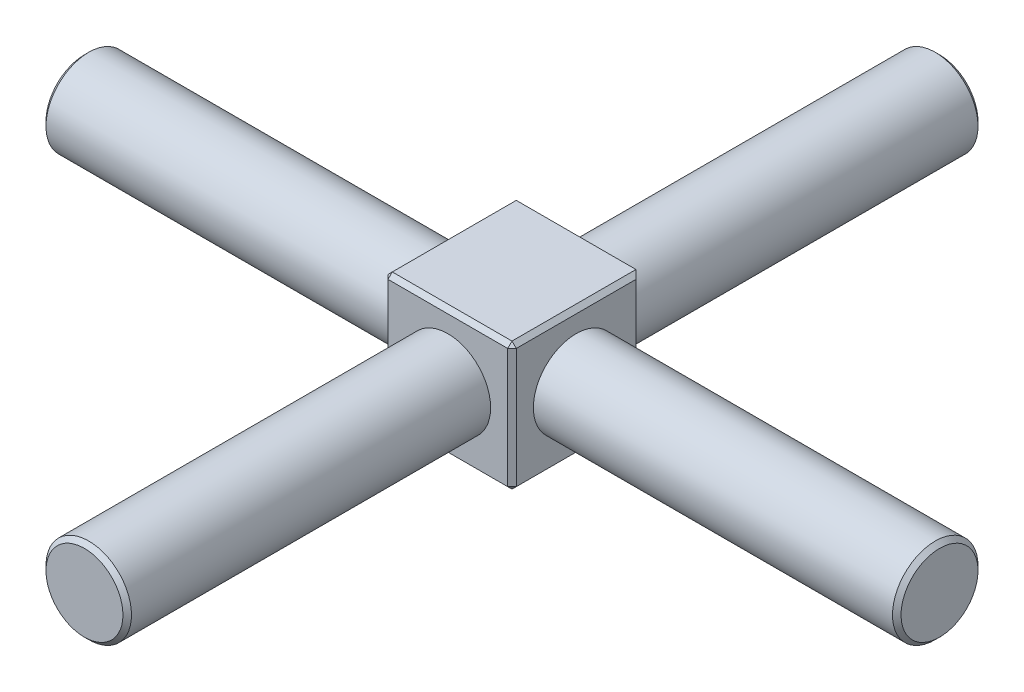
ISO-10303-21;
HEADER;
FILE_DESCRIPTION(('STEP AP214'),'2;1');
FILE_NAME('part.step','',(''),(''),'','','');
FILE_SCHEMA(('AUTOMOTIVE_DESIGN { 1 0 10303 214 1 1 1 1 }'));
ENDSEC;
DATA;
#1=APPLICATION_CONTEXT('core data for automotive mechanical design processes');
#2=APPLICATION_PROTOCOL_DEFINITION('international standard','automotive_design',2000,#1);
#3=PRODUCT_CONTEXT('',#1,'mechanical');
#4=PRODUCT('Part','Part','',(#3));
#5=PRODUCT_RELATED_PRODUCT_CATEGORY('part','',(#4));
#6=PRODUCT_DEFINITION_FORMATION('','',#4);
#7=PRODUCT_DEFINITION_CONTEXT('part definition',#1,'design');
#8=PRODUCT_DEFINITION('design','',#6,#7);
#9=PRODUCT_DEFINITION_SHAPE('','',#8);
#10=(LENGTH_UNIT() NAMED_UNIT(*) SI_UNIT(.MILLI.,.METRE.));
#11=(NAMED_UNIT(*) PLANE_ANGLE_UNIT() SI_UNIT($,.RADIAN.));
#12=(NAMED_UNIT(*) SI_UNIT($,.STERADIAN.) SOLID_ANGLE_UNIT());
#13=UNCERTAINTY_MEASURE_WITH_UNIT(LENGTH_MEASURE(1.E-05),#10,'distance_accuracy_value','');
#14=(GEOMETRIC_REPRESENTATION_CONTEXT(3) GLOBAL_UNCERTAINTY_ASSIGNED_CONTEXT((#13)) GLOBAL_UNIT_ASSIGNED_CONTEXT((#10,
#11,#12)) REPRESENTATION_CONTEXT('',''));
#15=CARTESIAN_POINT('',(0.,0.,0.));
#16=DIRECTION('',(0.,0.,1.));
#17=DIRECTION('',(1.,0.,0.));
#18=AXIS2_PLACEMENT_3D('',#15,#16,#17);
#19=CARTESIAN_POINT('',(7.5,7.5,15.));
#20=DIRECTION('',(-1.,0.,0.));
#21=DIRECTION('',(0.,-1.,0.));
#22=AXIS2_PLACEMENT_3D('',#19,#20,#21);
#23=PLANE('',#22);
#24=DIRECTION('',(0.,1.,0.));
#25=VECTOR('',#24,1.);
#26=CARTESIAN_POINT('',(7.5,7.5,0.5));
#27=LINE('',#26,#25);
#28=CARTESIAN_POINT('',(7.5,-7.,0.5));
#29=VERTEX_POINT('',#28);
#30=CARTESIAN_POINT('',(7.5,7.,0.5));
#31=VERTEX_POINT('',#30);
#32=EDGE_CURVE('E45',#29,#31,#27,.T.);
#33=ORIENTED_EDGE('',*,*,#32,.T.);
#34=DIRECTION('',(0.,0.,1.));
#35=VECTOR('',#34,1.);
#36=CARTESIAN_POINT('',(7.5,7.,15.));
#37=LINE('',#36,#35);
#38=CARTESIAN_POINT('',(7.5,7.,14.5));
#39=VERTEX_POINT('',#38);
#40=EDGE_CURVE('E11',#31,#39,#37,.T.);
#41=ORIENTED_EDGE('',*,*,#40,.T.);
#42=DIRECTION('',(0.,-1.,0.));
#43=VECTOR('',#42,1.);
#44=CARTESIAN_POINT('',(7.5,-7.5,14.5));
#45=LINE('',#44,#43);
#46=CARTESIAN_POINT('',(7.5,-7.,14.5));
#47=VERTEX_POINT('',#46);
#48=EDGE_CURVE('E178',#39,#47,#45,.T.);
#49=ORIENTED_EDGE('',*,*,#48,.T.);
#50=DIRECTION('',(0.,0.,-1.));
#51=VECTOR('',#50,1.);
#52=CARTESIAN_POINT('',(7.5,-7.,15.));
#53=LINE('',#52,#51);
#54=EDGE_CURVE('E56',#47,#29,#53,.T.);
#55=ORIENTED_EDGE('',*,*,#54,.T.);
#56=EDGE_LOOP('',(#33,#41,#49,#55));
#57=FACE_BOUND('',#56,.T.);
#58=CARTESIAN_POINT('',(7.5,0.,7.5));
#59=DIRECTION('',(-1.,0.,0.));
#60=DIRECTION('',(0.,-1.,0.));
#61=AXIS2_PLACEMENT_3D('',#58,#59,#60);
#62=CIRCLE('',#61,5.);
#63=CARTESIAN_POINT('',(7.5,-5.,7.5));
#64=VERTEX_POINT('',#63);
#65=EDGE_CURVE('E245',#64,#64,#62,.F.);
#66=ORIENTED_EDGE('',*,*,#65,.F.);
#67=EDGE_LOOP('',(#66));
#68=FACE_BOUND('',#67,.T.);
#69=ADVANCED_FACE('F36',(#57,#68),#23,.F.);
#70=CARTESIAN_POINT('',(-7.5,7.5,15.));
#71=DIRECTION('',(0.,-1.,0.));
#72=DIRECTION('',(0.,0.,-1.));
#73=AXIS2_PLACEMENT_3D('',#70,#71,#72);
#74=PLANE('',#73);
#75=DIRECTION('',(-1.,0.,0.));
#76=VECTOR('',#75,1.);
#77=CARTESIAN_POINT('',(-7.5,7.5,0.));
#78=LINE('',#77,#76);
#79=CARTESIAN_POINT('',(7.,7.5,0.));
#80=VERTEX_POINT('',#79);
#81=CARTESIAN_POINT('',(-7.,7.5,0.));
#82=VERTEX_POINT('',#81);
#83=EDGE_CURVE('E237',#80,#82,#78,.T.);
#84=ORIENTED_EDGE('',*,*,#83,.T.);
#85=DIRECTION('',(0.,0.,1.));
#86=VECTOR('',#85,1.);
#87=CARTESIAN_POINT('',(-7.,7.5,15.));
#88=LINE('',#87,#86);
#89=CARTESIAN_POINT('',(-7.,7.5,14.5));
#90=VERTEX_POINT('',#89);
#91=EDGE_CURVE('E125',#82,#90,#88,.T.);
#92=ORIENTED_EDGE('',*,*,#91,.T.);
#93=DIRECTION('',(1.,0.,0.));
#94=VECTOR('',#93,1.);
#95=CARTESIAN_POINT('',(7.5,7.5,14.5));
#96=LINE('',#95,#94);
#97=CARTESIAN_POINT('',(7.,7.5,14.5));
#98=VERTEX_POINT('',#97);
#99=EDGE_CURVE('E145',#90,#98,#96,.T.);
#100=ORIENTED_EDGE('',*,*,#99,.T.);
#101=DIRECTION('',(0.,0.,-1.));
#102=VECTOR('',#101,1.);
#103=CARTESIAN_POINT('',(7.,7.5,15.));
#104=LINE('',#103,#102);
#105=EDGE_CURVE('E147',#98,#80,#104,.T.);
#106=ORIENTED_EDGE('',*,*,#105,.T.);
#107=EDGE_LOOP('',(#84,#92,#100,#106));
#108=FACE_BOUND('',#107,.T.);
#109=ADVANCED_FACE('F298',(#108),#74,.F.);
#110=CARTESIAN_POINT('',(-7.5,7.5,15.));
#111=DIRECTION('',(1.,0.,0.));
#112=DIRECTION('',(0.,1.,0.));
#113=AXIS2_PLACEMENT_3D('',#110,#111,#112);
#114=PLANE('',#113);
#115=DIRECTION('',(0.,1.,0.));
#116=VECTOR('',#115,1.);
#117=CARTESIAN_POINT('',(-7.5,7.5,14.5));
#118=LINE('',#117,#116);
#119=CARTESIAN_POINT('',(-7.5,-7.,14.5));
#120=VERTEX_POINT('',#119);
#121=CARTESIAN_POINT('',(-7.5,7.,14.5));
#122=VERTEX_POINT('',#121);
#123=EDGE_CURVE('E143',#120,#122,#118,.T.);
#124=ORIENTED_EDGE('',*,*,#123,.T.);
#125=DIRECTION('',(0.,0.,-1.));
#126=VECTOR('',#125,1.);
#127=CARTESIAN_POINT('',(-7.5,7.,15.));
#128=LINE('',#127,#126);
#129=CARTESIAN_POINT('',(-7.5,7.,0.5));
#130=VERTEX_POINT('',#129);
#131=EDGE_CURVE('E123',#122,#130,#128,.T.);
#132=ORIENTED_EDGE('',*,*,#131,.T.);
#133=DIRECTION('',(0.,-1.,0.));
#134=VECTOR('',#133,1.);
#135=CARTESIAN_POINT('',(-7.5,7.5,0.5));
#136=LINE('',#135,#134);
#137=CARTESIAN_POINT('',(-7.5,-7.,0.5));
#138=VERTEX_POINT('',#137);
#139=EDGE_CURVE('E131',#130,#138,#136,.T.);
#140=ORIENTED_EDGE('',*,*,#139,.T.);
#141=DIRECTION('',(0.,0.,1.));
#142=VECTOR('',#141,1.);
#143=CARTESIAN_POINT('',(-7.5,-7.,15.));
#144=LINE('',#143,#142);
#145=EDGE_CURVE('E137',#138,#120,#144,.T.);
#146=ORIENTED_EDGE('',*,*,#145,.T.);
#147=EDGE_LOOP('',(#124,#132,#140,#146));
#148=FACE_BOUND('',#147,.T.);
#149=CARTESIAN_POINT('',(-7.5,0.,7.5));
#150=DIRECTION('',(1.,0.,0.));
#151=DIRECTION('',(0.,1.,0.));
#152=AXIS2_PLACEMENT_3D('',#149,#150,#151);
#153=CIRCLE('',#152,5.);
#154=CARTESIAN_POINT('',(-7.5,5.,7.5));
#155=VERTEX_POINT('',#154);
#156=EDGE_CURVE('E242',#155,#155,#153,.F.);
#157=ORIENTED_EDGE('',*,*,#156,.F.);
#158=EDGE_LOOP('',(#157));
#159=FACE_BOUND('',#158,.T.);
#160=ADVANCED_FACE('F140',(#148,#159),#114,.F.);
#161=CARTESIAN_POINT('',(-7.5,-7.5,15.));
#162=DIRECTION('',(0.,1.,0.));
#163=DIRECTION('',(0.,0.,1.));
#164=AXIS2_PLACEMENT_3D('',#161,#162,#163);
#165=PLANE('',#164);
#166=DIRECTION('',(-1.,0.,0.));
#167=VECTOR('',#166,1.);
#168=CARTESIAN_POINT('',(-7.5,-7.5,14.5));
#169=LINE('',#168,#167);
#170=CARTESIAN_POINT('',(7.,-7.5,14.5));
#171=VERTEX_POINT('',#170);
#172=CARTESIAN_POINT('',(-7.,-7.5,14.5));
#173=VERTEX_POINT('',#172);
#174=EDGE_CURVE('E163',#171,#173,#169,.T.);
#175=ORIENTED_EDGE('',*,*,#174,.T.);
#176=DIRECTION('',(0.,0.,-1.));
#177=VECTOR('',#176,1.);
#178=CARTESIAN_POINT('',(-7.,-7.5,15.));
#179=LINE('',#178,#177);
#180=CARTESIAN_POINT('',(-7.,-7.5,0.5));
#181=VERTEX_POINT('',#180);
#182=EDGE_CURVE('E169',#173,#181,#179,.T.);
#183=ORIENTED_EDGE('',*,*,#182,.T.);
#184=DIRECTION('',(1.,0.,0.));
#185=VECTOR('',#184,1.);
#186=CARTESIAN_POINT('',(-7.5,-7.5,0.5));
#187=LINE('',#186,#185);
#188=CARTESIAN_POINT('',(7.,-7.5,0.5));
#189=VERTEX_POINT('',#188);
#190=EDGE_CURVE('E167',#181,#189,#187,.T.);
#191=ORIENTED_EDGE('',*,*,#190,.T.);
#192=DIRECTION('',(0.,0.,1.));
#193=VECTOR('',#192,1.);
#194=CARTESIAN_POINT('',(7.,-7.5,15.));
#195=LINE('',#194,#193);
#196=EDGE_CURVE('E165',#189,#171,#195,.T.);
#197=ORIENTED_EDGE('',*,*,#196,.T.);
#198=EDGE_LOOP('',(#175,#183,#191,#197));
#199=FACE_BOUND('',#198,.T.);
#200=ADVANCED_FACE('F578',(#199),#165,.F.);
#201=CARTESIAN_POINT('',(0.,0.,15.));
#202=DIRECTION('',(0.,0.,1.));
#203=DIRECTION('',(1.,0.,0.));
#204=AXIS2_PLACEMENT_3D('',#201,#202,#203);
#205=PLANE('',#204);
#206=DIRECTION('',(-1.,0.,0.));
#207=VECTOR('',#206,1.);
#208=CARTESIAN_POINT('',(-7.5,7.,15.));
#209=LINE('',#208,#207);
#210=CARTESIAN_POINT('',(7.,7.,15.));
#211=VERTEX_POINT('',#210);
#212=CARTESIAN_POINT('',(-7.,7.,15.));
#213=VERTEX_POINT('',#212);
#214=EDGE_CURVE('E154',#211,#213,#209,.T.);
#215=ORIENTED_EDGE('',*,*,#214,.T.);
#216=DIRECTION('',(0.,-1.,0.));
#217=VECTOR('',#216,1.);
#218=CARTESIAN_POINT('',(-7.,-7.5,15.));
#219=LINE('',#218,#217);
#220=CARTESIAN_POINT('',(-7.,-7.,15.));
#221=VERTEX_POINT('',#220);
#222=EDGE_CURVE('E160',#213,#221,#219,.T.);
#223=ORIENTED_EDGE('',*,*,#222,.T.);
#224=DIRECTION('',(1.,0.,0.));
#225=VECTOR('',#224,1.);
#226=CARTESIAN_POINT('',(7.5,-7.,15.));
#227=LINE('',#226,#225);
#228=CARTESIAN_POINT('',(7.,-7.,15.));
#229=VERTEX_POINT('',#228);
#230=EDGE_CURVE('E158',#221,#229,#227,.T.);
#231=ORIENTED_EDGE('',*,*,#230,.T.);
#232=DIRECTION('',(0.,1.,0.));
#233=VECTOR('',#232,1.);
#234=CARTESIAN_POINT('',(7.,7.5,15.));
#235=LINE('',#234,#233);
#236=EDGE_CURVE('E156',#229,#211,#235,.T.);
#237=ORIENTED_EDGE('',*,*,#236,.T.);
#238=EDGE_LOOP('',(#215,#223,#231,#237));
#239=FACE_BOUND('',#238,.T.);
#240=CARTESIAN_POINT('',(0.,0.,15.));
#241=DIRECTION('',(0.,0.,1.));
#242=DIRECTION('',(1.,0.,0.));
#243=AXIS2_PLACEMENT_3D('',#240,#241,#242);
#244=CIRCLE('',#243,5.);
#245=CARTESIAN_POINT('',(5.,0.,15.));
#246=VERTEX_POINT('',#245);
#247=EDGE_CURVE('E231',#246,#246,#244,.F.);
#248=ORIENTED_EDGE('',*,*,#247,.T.);
#249=EDGE_LOOP('',(#248));
#250=FACE_BOUND('',#249,.T.);
#251=ADVANCED_FACE('F569',(#239,#250),#205,.T.);
#252=CARTESIAN_POINT('',(0.,0.,0.));
#253=DIRECTION('',(0.,0.,1.));
#254=DIRECTION('',(1.,0.,0.));
#255=AXIS2_PLACEMENT_3D('',#252,#253,#254);
#256=PLANE('',#255);
#257=CARTESIAN_POINT('',(0.,0.,0.));
#258=DIRECTION('',(0.,0.,1.));
#259=DIRECTION('',(1.,0.,0.));
#260=AXIS2_PLACEMENT_3D('',#257,#258,#259);
#261=CIRCLE('',#260,5.);
#262=CARTESIAN_POINT('',(5.,0.,0.));
#263=VERTEX_POINT('',#262);
#264=EDGE_CURVE('E247',#263,#263,#261,.F.);
#265=ORIENTED_EDGE('',*,*,#264,.F.);
#266=EDGE_LOOP('',(#265));
#267=FACE_BOUND('',#266,.T.);
#268=DIRECTION('',(-1.,0.,0.));
#269=VECTOR('',#268,1.);
#270=CARTESIAN_POINT('',(0.,-7.,0.));
#271=LINE('',#270,#269);
#272=CARTESIAN_POINT('',(7.,-7.,0.));
#273=VERTEX_POINT('',#272);
#274=CARTESIAN_POINT('',(-7.,-7.,0.));
#275=VERTEX_POINT('',#274);
#276=EDGE_CURVE('E174',#273,#275,#271,.T.);
#277=ORIENTED_EDGE('',*,*,#276,.T.);
#278=DIRECTION('',(0.,1.,0.));
#279=VECTOR('',#278,1.);
#280=CARTESIAN_POINT('',(-7.,0.,0.));
#281=LINE('',#280,#279);
#282=EDGE_CURVE('E176',#275,#82,#281,.T.);
#283=ORIENTED_EDGE('',*,*,#282,.T.);
#284=ORIENTED_EDGE('',*,*,#83,.F.);
#285=DIRECTION('',(0.,-1.,0.));
#286=VECTOR('',#285,1.);
#287=CARTESIAN_POINT('',(7.,0.,0.));
#288=LINE('',#287,#286);
#289=EDGE_CURVE('E172',#80,#273,#288,.T.);
#290=ORIENTED_EDGE('',*,*,#289,.T.);
#291=EDGE_LOOP('',(#277,#283,#284,#290));
#292=FACE_BOUND('',#291,.T.);
#293=ADVANCED_FACE('F302',(#267,#292),#256,.F.);
#294=CARTESIAN_POINT('',(-50.,0.,7.5));
#295=DIRECTION('',(1.,0.,0.));
#296=DIRECTION('',(0.,1.,0.));
#297=AXIS2_PLACEMENT_3D('',#294,#295,#296);
#298=PLANE('',#297);
#299=CARTESIAN_POINT('',(-50.,0.,7.5));
#300=DIRECTION('',(1.,0.,0.));
#301=DIRECTION('',(0.,1.,0.));
#302=AXIS2_PLACEMENT_3D('',#299,#300,#301);
#303=CIRCLE('',#302,4.49999999999999);
#304=CARTESIAN_POINT('',(-50.,4.49999999999998,7.5));
#305=VERTEX_POINT('',#304);
#306=EDGE_CURVE('E268',#305,#305,#303,.F.);
#307=ORIENTED_EDGE('',*,*,#306,.T.);
#308=EDGE_LOOP('',(#307));
#309=FACE_BOUND('',#308,.T.);
#310=ADVANCED_FACE('F552',(#309),#298,.F.);
#311=CARTESIAN_POINT('',(50.,0.,7.5));
#312=DIRECTION('',(-1.,0.,0.));
#313=DIRECTION('',(0.,-1.,0.));
#314=AXIS2_PLACEMENT_3D('',#311,#312,#313);
#315=CYLINDRICAL_SURFACE('',#314,5.);
#316=CARTESIAN_POINT('',(-49.5,0.,7.5));
#317=DIRECTION('',(1.,0.,0.));
#318=DIRECTION('',(0.,1.,0.));
#319=AXIS2_PLACEMENT_3D('',#316,#317,#318);
#320=CIRCLE('',#319,5.);
#321=CARTESIAN_POINT('',(-49.5,4.99999999999999,7.5));
#322=VERTEX_POINT('',#321);
#323=EDGE_CURVE('E265',#322,#322,#320,.T.);
#324=ORIENTED_EDGE('',*,*,#323,.T.);
#325=EDGE_LOOP('',(#324));
#326=FACE_BOUND('',#325,.T.);
#327=ORIENTED_EDGE('',*,*,#156,.T.);
#328=EDGE_LOOP('',(#327));
#329=FACE_BOUND('',#328,.T.);
#330=ADVANCED_FACE('F543',(#326,#329),#315,.T.);
#331=CARTESIAN_POINT('',(49.5,0.,7.5));
#332=DIRECTION('',(1.,0.,0.));
#333=DIRECTION('',(0.,1.,0.));
#334=AXIS2_PLACEMENT_3D('',#331,#332,#333);
#335=CIRCLE('',#334,5.);
#336=CARTESIAN_POINT('',(49.5,5.00000000000001,7.5));
#337=VERTEX_POINT('',#336);
#338=EDGE_CURVE('E256',#337,#337,#335,.F.);
#339=ORIENTED_EDGE('',*,*,#338,.T.);
#340=EDGE_LOOP('',(#339));
#341=FACE_BOUND('',#340,.T.);
#342=ORIENTED_EDGE('',*,*,#65,.T.);
#343=EDGE_LOOP('',(#342));
#344=FACE_BOUND('',#343,.T.);
#345=ADVANCED_FACE('F534',(#341,#344),#315,.T.);
#346=CARTESIAN_POINT('',(50.,0.,7.5));
#347=DIRECTION('',(1.,0.,0.));
#348=DIRECTION('',(0.,1.,0.));
#349=AXIS2_PLACEMENT_3D('',#346,#347,#348);
#350=PLANE('',#349);
#351=CARTESIAN_POINT('',(50.,0.,7.5));
#352=DIRECTION('',(1.,0.,0.));
#353=DIRECTION('',(0.,1.,0.));
#354=AXIS2_PLACEMENT_3D('',#351,#352,#353);
#355=CIRCLE('',#354,4.5);
#356=CARTESIAN_POINT('',(50.,4.50000000000001,7.5));
#357=VERTEX_POINT('',#356);
#358=EDGE_CURVE('E253',#357,#357,#355,.T.);
#359=ORIENTED_EDGE('',*,*,#358,.T.);
#360=EDGE_LOOP('',(#359));
#361=FACE_BOUND('',#360,.T.);
#362=ADVANCED_FACE('F524',(#361),#350,.T.);
#363=CARTESIAN_POINT('',(0.,0.,-42.5));
#364=DIRECTION('',(0.,0.,1.));
#365=DIRECTION('',(1.,0.,0.));
#366=AXIS2_PLACEMENT_3D('',#363,#364,#365);
#367=PLANE('',#366);
#368=CARTESIAN_POINT('',(0.,0.,-42.5));
#369=DIRECTION('',(0.,0.,1.));
#370=DIRECTION('',(1.,0.,0.));
#371=AXIS2_PLACEMENT_3D('',#368,#369,#370);
#372=CIRCLE('',#371,4.49999999999998);
#373=CARTESIAN_POINT('',(4.49999999999998,0.,-42.5));
#374=VERTEX_POINT('',#373);
#375=EDGE_CURVE('E262',#374,#374,#372,.F.);
#376=ORIENTED_EDGE('',*,*,#375,.T.);
#377=EDGE_LOOP('',(#376));
#378=FACE_BOUND('',#377,.T.);
#379=ADVANCED_FACE('F516',(#378),#367,.F.);
#380=CARTESIAN_POINT('',(0.,0.,57.5));
#381=DIRECTION('',(0.,0.,-1.));
#382=DIRECTION('',(-1.,0.,0.));
#383=AXIS2_PLACEMENT_3D('',#380,#381,#382);
#384=CYLINDRICAL_SURFACE('',#383,5.);
#385=CARTESIAN_POINT('',(0.,0.,-42.));
#386=DIRECTION('',(0.,0.,1.));
#387=DIRECTION('',(1.,0.,0.));
#388=AXIS2_PLACEMENT_3D('',#385,#386,#387);
#389=CIRCLE('',#388,5.);
#390=CARTESIAN_POINT('',(5.,0.,-42.));
#391=VERTEX_POINT('',#390);
#392=EDGE_CURVE('E259',#391,#391,#389,.T.);
#393=ORIENTED_EDGE('',*,*,#392,.T.);
#394=EDGE_LOOP('',(#393));
#395=FACE_BOUND('',#394,.T.);
#396=ORIENTED_EDGE('',*,*,#264,.T.);
#397=EDGE_LOOP('',(#396));
#398=FACE_BOUND('',#397,.T.);
#399=ADVANCED_FACE('F507',(#395,#398),#384,.T.);
#400=CARTESIAN_POINT('',(0.,0.,57.));
#401=DIRECTION('',(0.,0.,1.));
#402=DIRECTION('',(1.,0.,0.));
#403=AXIS2_PLACEMENT_3D('',#400,#401,#402);
#404=CIRCLE('',#403,5.);
#405=CARTESIAN_POINT('',(5.,0.,57.));
#406=VERTEX_POINT('',#405);
#407=EDGE_CURVE('E138',#406,#406,#404,.F.);
#408=ORIENTED_EDGE('',*,*,#407,.T.);
#409=EDGE_LOOP('',(#408));
#410=FACE_BOUND('',#409,.T.);
#411=ORIENTED_EDGE('',*,*,#247,.F.);
#412=EDGE_LOOP('',(#411));
#413=FACE_BOUND('',#412,.T.);
#414=ADVANCED_FACE('F498',(#410,#413),#384,.T.);
#415=CARTESIAN_POINT('',(0.,0.,57.5));
#416=DIRECTION('',(0.,0.,1.));
#417=DIRECTION('',(1.,0.,0.));
#418=AXIS2_PLACEMENT_3D('',#415,#416,#417);
#419=PLANE('',#418);
#420=CARTESIAN_POINT('',(0.,0.,57.5));
#421=DIRECTION('',(0.,0.,1.));
#422=DIRECTION('',(1.,0.,0.));
#423=AXIS2_PLACEMENT_3D('',#420,#421,#422);
#424=CIRCLE('',#423,4.5);
#425=CARTESIAN_POINT('',(4.5,0.,57.5));
#426=VERTEX_POINT('',#425);
#427=EDGE_CURVE('E271',#426,#426,#424,.T.);
#428=ORIENTED_EDGE('',*,*,#427,.T.);
#429=EDGE_LOOP('',(#428));
#430=FACE_BOUND('',#429,.T.);
#431=ADVANCED_FACE('F338',(#430),#419,.T.);
#432=CARTESIAN_POINT('',(50.,0.,7.5));
#433=DIRECTION('',(-1.,0.,0.));
#434=DIRECTION('',(0.,-1.,0.));
#435=AXIS2_PLACEMENT_3D('',#432,#433,#434);
#436=CONICAL_SURFACE('',#435,4.5,0.785398163397445);
#437=ORIENTED_EDGE('',*,*,#338,.F.);
#438=EDGE_LOOP('',(#437));
#439=FACE_BOUND('',#438,.T.);
#440=ORIENTED_EDGE('',*,*,#358,.F.);
#441=EDGE_LOOP('',(#440));
#442=FACE_BOUND('',#441,.T.);
#443=ADVANCED_FACE('F334',(#439,#442),#436,.T.);
#444=CARTESIAN_POINT('',(0.,0.,-42.));
#445=DIRECTION('',(0.,0.,1.));
#446=DIRECTION('',(1.,0.,0.));
#447=AXIS2_PLACEMENT_3D('',#444,#445,#446);
#448=CONICAL_SURFACE('',#447,5.,0.785398163397444);
#449=ORIENTED_EDGE('',*,*,#375,.F.);
#450=EDGE_LOOP('',(#449));
#451=FACE_BOUND('',#450,.T.);
#452=ORIENTED_EDGE('',*,*,#392,.F.);
#453=EDGE_LOOP('',(#452));
#454=FACE_BOUND('',#453,.T.);
#455=ADVANCED_FACE('F337',(#451,#454),#448,.T.);
#456=CARTESIAN_POINT('',(-49.5,0.,7.5));
#457=DIRECTION('',(1.,0.,0.));
#458=DIRECTION('',(0.,1.,0.));
#459=AXIS2_PLACEMENT_3D('',#456,#457,#458);
#460=CONICAL_SURFACE('',#459,5.,0.785398163397445);
#461=ORIENTED_EDGE('',*,*,#306,.F.);
#462=EDGE_LOOP('',(#461));
#463=FACE_BOUND('',#462,.T.);
#464=ORIENTED_EDGE('',*,*,#323,.F.);
#465=EDGE_LOOP('',(#464));
#466=FACE_BOUND('',#465,.T.);
#467=ADVANCED_FACE('F342',(#463,#466),#460,.T.);
#468=CARTESIAN_POINT('',(0.,0.,57.5));
#469=DIRECTION('',(0.,0.,-1.));
#470=DIRECTION('',(-1.,0.,0.));
#471=AXIS2_PLACEMENT_3D('',#468,#469,#470);
#472=CONICAL_SURFACE('',#471,4.5,0.785398163397444);
#473=ORIENTED_EDGE('',*,*,#407,.F.);
#474=EDGE_LOOP('',(#473));
#475=FACE_BOUND('',#474,.T.);
#476=ORIENTED_EDGE('',*,*,#427,.F.);
#477=EDGE_LOOP('',(#476));
#478=FACE_BOUND('',#477,.T.);
#479=ADVANCED_FACE('F346',(#475,#478),#472,.T.);
#480=CARTESIAN_POINT('',(7.,-7.5,14.5));
#481=DIRECTION('',(0.577350269189626,-0.577350269189625,0.577350269189626));
#482=DIRECTION('',(0.707106781186547,0.,-0.707106781186548));
#483=AXIS2_PLACEMENT_3D('',#480,#481,#482);
#484=PLANE('',#483);
#485=DIRECTION('',(0.,-0.707106781186547,-0.707106781186547));
#486=VECTOR('',#485,1.);
#487=CARTESIAN_POINT('',(7.,-7.5,14.5));
#488=LINE('',#487,#486);
#489=EDGE_CURVE('E220',#171,#229,#488,.F.);
#490=ORIENTED_EDGE('',*,*,#489,.F.);
#491=DIRECTION('',(-0.707106781186547,-0.707106781186548,0.));
#492=VECTOR('',#491,1.);
#493=CARTESIAN_POINT('',(7.,-7.5,14.5));
#494=LINE('',#493,#492);
#495=EDGE_CURVE('E40',#47,#171,#494,.T.);
#496=ORIENTED_EDGE('',*,*,#495,.F.);
#497=DIRECTION('',(-0.707106781186548,0.,0.707106781186548));
#498=VECTOR('',#497,1.);
#499=CARTESIAN_POINT('',(7.25,-7.,14.75));
#500=LINE('',#499,#498);
#501=EDGE_CURVE('E223',#229,#47,#500,.F.);
#502=ORIENTED_EDGE('',*,*,#501,.F.);
#503=EDGE_LOOP('',(#490,#496,#502));
#504=FACE_BOUND('',#503,.T.);
#505=ADVANCED_FACE('F38',(#504),#484,.T.);
#506=CARTESIAN_POINT('',(7.5,-7.,15.));
#507=DIRECTION('',(-0.707106781186548,0.707106781186547,0.));
#508=DIRECTION('',(0.,0.,-1.));
#509=AXIS2_PLACEMENT_3D('',#506,#507,#508);
#510=PLANE('',#509);
#511=ORIENTED_EDGE('',*,*,#495,.T.);
#512=ORIENTED_EDGE('',*,*,#196,.F.);
#513=DIRECTION('',(0.707106781186547,0.707106781186548,0.));
#514=VECTOR('',#513,1.);
#515=CARTESIAN_POINT('',(7.,-7.5,0.5));
#516=LINE('',#515,#514);
#517=EDGE_CURVE('E217',#29,#189,#516,.F.);
#518=ORIENTED_EDGE('',*,*,#517,.F.);
#519=ORIENTED_EDGE('',*,*,#54,.F.);
#520=EDGE_LOOP('',(#511,#512,#518,#519));
#521=FACE_BOUND('',#520,.T.);
#522=ADVANCED_FACE('F457',(#521),#510,.F.);
#523=CARTESIAN_POINT('',(7.5,7.5,0.5));
#524=DIRECTION('',(-0.707106781186547,0.,0.707106781186547));
#525=DIRECTION('',(0.,1.,0.));
#526=AXIS2_PLACEMENT_3D('',#523,#524,#525);
#527=PLANE('',#526);
#528=DIRECTION('',(-0.707106781186548,0.,-0.707106781186548));
#529=VECTOR('',#528,1.);
#530=CARTESIAN_POINT('',(7.25,-7.,0.250000000000001));
#531=LINE('',#530,#529);
#532=EDGE_CURVE('E214',#273,#29,#531,.F.);
#533=ORIENTED_EDGE('',*,*,#532,.F.);
#534=ORIENTED_EDGE('',*,*,#289,.F.);
#535=DIRECTION('',(0.577350269189626,-0.577350269189625,0.577350269189626));
#536=VECTOR('',#535,1.);
#537=CARTESIAN_POINT('',(7.33333333333333,7.16666666666667,0.333333333333334));
#538=LINE('',#537,#536);
#539=EDGE_CURVE('E225',#31,#80,#538,.F.);
#540=ORIENTED_EDGE('',*,*,#539,.F.);
#541=ORIENTED_EDGE('',*,*,#32,.F.);
#542=EDGE_LOOP('',(#533,#534,#540,#541));
#543=FACE_BOUND('',#542,.T.);
#544=ADVANCED_FACE('F305',(#543),#527,.F.);
#545=CARTESIAN_POINT('',(7.,7.5,15.));
#546=DIRECTION('',(-0.707106781186547,-0.707106781186548,0.));
#547=DIRECTION('',(0.,0.,-1.));
#548=AXIS2_PLACEMENT_3D('',#545,#546,#547);
#549=PLANE('',#548);
#550=ORIENTED_EDGE('',*,*,#539,.T.);
#551=ORIENTED_EDGE('',*,*,#105,.F.);
#552=DIRECTION('',(0.707106781186548,-0.707106781186547,0.));
#553=VECTOR('',#552,1.);
#554=CARTESIAN_POINT('',(7.5,7.,14.5));
#555=LINE('',#554,#553);
#556=EDGE_CURVE('E211',#39,#98,#555,.F.);
#557=ORIENTED_EDGE('',*,*,#556,.F.);
#558=ORIENTED_EDGE('',*,*,#40,.F.);
#559=EDGE_LOOP('',(#550,#551,#557,#558));
#560=FACE_BOUND('',#559,.T.);
#561=ADVANCED_FACE('F441',(#560),#549,.F.);
#562=CARTESIAN_POINT('',(7.,0.,15.));
#563=DIRECTION('',(0.707106781186547,0.,0.707106781186547));
#564=DIRECTION('',(0.,-1.,0.));
#565=AXIS2_PLACEMENT_3D('',#562,#563,#564);
#566=PLANE('',#565);
#567=ORIENTED_EDGE('',*,*,#501,.T.);
#568=ORIENTED_EDGE('',*,*,#48,.F.);
#569=DIRECTION('',(0.707106781186548,0.,-0.707106781186548));
#570=VECTOR('',#569,1.);
#571=CARTESIAN_POINT('',(7.5,7.,14.5));
#572=LINE('',#571,#570);
#573=EDGE_CURVE('E209',#211,#39,#572,.T.);
#574=ORIENTED_EDGE('',*,*,#573,.F.);
#575=ORIENTED_EDGE('',*,*,#236,.F.);
#576=EDGE_LOOP('',(#567,#568,#574,#575));
#577=FACE_BOUND('',#576,.T.);
#578=ADVANCED_FACE('F432',(#577),#566,.T.);
#579=CARTESIAN_POINT('',(0.,-7.,15.));
#580=DIRECTION('',(0.,-0.707106781186547,0.707106781186547));
#581=DIRECTION('',(-1.,0.,0.));
#582=AXIS2_PLACEMENT_3D('',#579,#580,#581);
#583=PLANE('',#582);
#584=ORIENTED_EDGE('',*,*,#489,.T.);
#585=ORIENTED_EDGE('',*,*,#230,.F.);
#586=DIRECTION('',(0.,0.707106781186547,0.707106781186547));
#587=VECTOR('',#586,1.);
#588=CARTESIAN_POINT('',(-7.,-7.,15.));
#589=LINE('',#588,#587);
#590=EDGE_CURVE('E206',#173,#221,#589,.T.);
#591=ORIENTED_EDGE('',*,*,#590,.F.);
#592=ORIENTED_EDGE('',*,*,#174,.F.);
#593=EDGE_LOOP('',(#584,#585,#591,#592));
#594=FACE_BOUND('',#593,.T.);
#595=ADVANCED_FACE('F424',(#594),#583,.T.);
#596=CARTESIAN_POINT('',(7.,-7.5,0.5));
#597=DIRECTION('',(0.577350269189626,-0.577350269189625,-0.577350269189626));
#598=DIRECTION('',(-0.707106781186547,0.,-0.707106781186548));
#599=AXIS2_PLACEMENT_3D('',#596,#597,#598);
#600=PLANE('',#599);
#601=ORIENTED_EDGE('',*,*,#532,.T.);
#602=ORIENTED_EDGE('',*,*,#517,.T.);
#603=DIRECTION('',(0.,-0.707106781186547,0.707106781186547));
#604=VECTOR('',#603,1.);
#605=CARTESIAN_POINT('',(7.,-7.5,0.5));
#606=LINE('',#605,#604);
#607=EDGE_CURVE('E200',#273,#189,#606,.T.);
#608=ORIENTED_EDGE('',*,*,#607,.F.);
#609=EDGE_LOOP('',(#601,#602,#608));
#610=FACE_BOUND('',#609,.T.);
#611=ADVANCED_FACE('F310',(#610),#600,.T.);
#612=CARTESIAN_POINT('',(7.5,7.,14.5));
#613=DIRECTION('',(0.577350269189625,0.577350269189626,0.577350269189625));
#614=DIRECTION('',(0.,-0.707106781186547,0.707106781186548));
#615=AXIS2_PLACEMENT_3D('',#612,#613,#614);
#616=PLANE('',#615);
#617=ORIENTED_EDGE('',*,*,#573,.T.);
#618=ORIENTED_EDGE('',*,*,#556,.T.);
#619=DIRECTION('',(0.,-0.707106781186547,0.707106781186547));
#620=VECTOR('',#619,1.);
#621=CARTESIAN_POINT('',(7.,7.25,14.75));
#622=LINE('',#621,#620);
#623=EDGE_CURVE('E197',#211,#98,#622,.F.);
#624=ORIENTED_EDGE('',*,*,#623,.F.);
#625=EDGE_LOOP('',(#617,#618,#624));
#626=FACE_BOUND('',#625,.T.);
#627=ADVANCED_FACE('F408',(#626),#616,.T.);
#628=CARTESIAN_POINT('',(-7.,-7.,15.));
#629=DIRECTION('',(-0.577350269189626,-0.577350269189626,0.577350269189626));
#630=DIRECTION('',(0.707106781186547,0.,0.707106781186547));
#631=AXIS2_PLACEMENT_3D('',#628,#629,#630);
#632=PLANE('',#631);
#633=DIRECTION('',(-0.707106781186547,0.,-0.707106781186547));
#634=VECTOR('',#633,1.);
#635=CARTESIAN_POINT('',(-7.,-7.,15.));
#636=LINE('',#635,#634);
#637=EDGE_CURVE('E195',#120,#221,#636,.F.);
#638=ORIENTED_EDGE('',*,*,#637,.F.);
#639=DIRECTION('',(-0.707106781186547,0.707106781186547,0.));
#640=VECTOR('',#639,1.);
#641=CARTESIAN_POINT('',(-7.25,-7.25,14.5));
#642=LINE('',#641,#640);
#643=EDGE_CURVE('E203',#173,#120,#642,.T.);
#644=ORIENTED_EDGE('',*,*,#643,.F.);
#645=ORIENTED_EDGE('',*,*,#590,.T.);
#646=EDGE_LOOP('',(#638,#644,#645));
#647=FACE_BOUND('',#646,.T.);
#648=ADVANCED_FACE('F282',(#647),#632,.T.);
#649=CARTESIAN_POINT('',(-7.,-7.5,15.));
#650=DIRECTION('',(0.707106781186547,0.707106781186547,0.));
#651=DIRECTION('',(0.,0.,-1.));
#652=AXIS2_PLACEMENT_3D('',#649,#650,#651);
#653=PLANE('',#652);
#654=ORIENTED_EDGE('',*,*,#643,.T.);
#655=ORIENTED_EDGE('',*,*,#145,.F.);
#656=DIRECTION('',(0.707106781186547,-0.707106781186547,0.));
#657=VECTOR('',#656,1.);
#658=CARTESIAN_POINT('',(-7.,-7.5,0.5));
#659=LINE('',#658,#657);
#660=EDGE_CURVE('E192',#181,#138,#659,.F.);
#661=ORIENTED_EDGE('',*,*,#660,.F.);
#662=ORIENTED_EDGE('',*,*,#182,.F.);
#663=EDGE_LOOP('',(#654,#655,#661,#662));
#664=FACE_BOUND('',#663,.T.);
#665=ADVANCED_FACE('F280',(#664),#653,.F.);
#666=CARTESIAN_POINT('',(-7.5,-7.5,0.5));
#667=DIRECTION('',(0.,0.707106781186547,0.707106781186547));
#668=DIRECTION('',(1.,0.,0.));
#669=AXIS2_PLACEMENT_3D('',#666,#667,#668);
#670=PLANE('',#669);
#671=ORIENTED_EDGE('',*,*,#607,.T.);
#672=ORIENTED_EDGE('',*,*,#190,.F.);
#673=DIRECTION('',(0.,0.707106781186547,-0.707106781186547));
#674=VECTOR('',#673,1.);
#675=CARTESIAN_POINT('',(-7.,-7.5,0.5));
#676=LINE('',#675,#674);
#677=EDGE_CURVE('E190',#275,#181,#676,.F.);
#678=ORIENTED_EDGE('',*,*,#677,.F.);
#679=ORIENTED_EDGE('',*,*,#276,.F.);
#680=EDGE_LOOP('',(#671,#672,#678,#679));
#681=FACE_BOUND('',#680,.T.);
#682=ADVANCED_FACE('F314',(#681),#670,.F.);
#683=CARTESIAN_POINT('',(0.,7.,15.));
#684=DIRECTION('',(0.,0.707106781186547,0.707106781186547));
#685=DIRECTION('',(1.,0.,0.));
#686=AXIS2_PLACEMENT_3D('',#683,#684,#685);
#687=PLANE('',#686);
#688=ORIENTED_EDGE('',*,*,#623,.T.);
#689=ORIENTED_EDGE('',*,*,#99,.F.);
#690=DIRECTION('',(0.,0.707106781186547,-0.707106781186547));
#691=VECTOR('',#690,1.);
#692=CARTESIAN_POINT('',(-7.,7.5,14.5));
#693=LINE('',#692,#691);
#694=EDGE_CURVE('E187',#213,#90,#693,.T.);
#695=ORIENTED_EDGE('',*,*,#694,.F.);
#696=ORIENTED_EDGE('',*,*,#214,.F.);
#697=EDGE_LOOP('',(#688,#689,#695,#696));
#698=FACE_BOUND('',#697,.T.);
#699=ADVANCED_FACE('F295',(#698),#687,.T.);
#700=CARTESIAN_POINT('',(-7.,0.,15.));
#701=DIRECTION('',(-0.707106781186547,0.,0.707106781186547));
#702=DIRECTION('',(0.,1.,0.));
#703=AXIS2_PLACEMENT_3D('',#700,#701,#702);
#704=PLANE('',#703);
#705=ORIENTED_EDGE('',*,*,#637,.T.);
#706=ORIENTED_EDGE('',*,*,#222,.F.);
#707=DIRECTION('',(0.707106781186548,0.,0.707106781186548));
#708=VECTOR('',#707,1.);
#709=CARTESIAN_POINT('',(-7.25,7.,14.75));
#710=LINE('',#709,#708);
#711=EDGE_CURVE('E184',#122,#213,#710,.T.);
#712=ORIENTED_EDGE('',*,*,#711,.F.);
#713=ORIENTED_EDGE('',*,*,#123,.F.);
#714=EDGE_LOOP('',(#705,#706,#712,#713));
#715=FACE_BOUND('',#714,.T.);
#716=ADVANCED_FACE('F287',(#715),#704,.T.);
#717=CARTESIAN_POINT('',(-7.,-7.5,0.5));
#718=DIRECTION('',(-0.577350269189626,-0.577350269189626,-0.577350269189626));
#719=DIRECTION('',(-0.707106781186547,0.,0.707106781186547));
#720=AXIS2_PLACEMENT_3D('',#717,#718,#719);
#721=PLANE('',#720);
#722=ORIENTED_EDGE('',*,*,#677,.T.);
#723=ORIENTED_EDGE('',*,*,#660,.T.);
#724=DIRECTION('',(-0.707106781186547,0.,0.707106781186547));
#725=VECTOR('',#724,1.);
#726=CARTESIAN_POINT('',(-7.25,-7.,0.25));
#727=LINE('',#726,#725);
#728=EDGE_CURVE('E134',#275,#138,#727,.T.);
#729=ORIENTED_EDGE('',*,*,#728,.F.);
#730=EDGE_LOOP('',(#722,#723,#729));
#731=FACE_BOUND('',#730,.T.);
#732=ADVANCED_FACE('F316',(#731),#721,.T.);
#733=CARTESIAN_POINT('',(-7.,7.5,14.5));
#734=DIRECTION('',(-0.577350269189626,0.577350269189626,0.577350269189626));
#735=DIRECTION('',(0.707106781186547,0.,0.707106781186547));
#736=AXIS2_PLACEMENT_3D('',#733,#734,#735);
#737=PLANE('',#736);
#738=ORIENTED_EDGE('',*,*,#711,.T.);
#739=ORIENTED_EDGE('',*,*,#694,.T.);
#740=DIRECTION('',(0.707106781186547,0.707106781186547,0.));
#741=VECTOR('',#740,1.);
#742=CARTESIAN_POINT('',(-7.,7.5,14.5));
#743=LINE('',#742,#741);
#744=EDGE_CURVE('E128',#122,#90,#743,.T.);
#745=ORIENTED_EDGE('',*,*,#744,.F.);
#746=EDGE_LOOP('',(#738,#739,#745));
#747=FACE_BOUND('',#746,.T.);
#748=ADVANCED_FACE('F291',(#747),#737,.T.);
#749=CARTESIAN_POINT('',(-7.5,7.5,0.5));
#750=DIRECTION('',(0.707106781186547,0.,0.707106781186547));
#751=DIRECTION('',(0.,-1.,0.));
#752=AXIS2_PLACEMENT_3D('',#749,#750,#751);
#753=PLANE('',#752);
#754=ORIENTED_EDGE('',*,*,#728,.T.);
#755=ORIENTED_EDGE('',*,*,#139,.F.);
#756=DIRECTION('',(0.577350269189626,0.577350269189626,-0.577350269189626));
#757=VECTOR('',#756,1.);
#758=CARTESIAN_POINT('',(-7.33333333333334,7.16666666666667,0.333333333333334));
#759=LINE('',#758,#757);
#760=EDGE_CURVE('E119',#82,#130,#759,.F.);
#761=ORIENTED_EDGE('',*,*,#760,.F.);
#762=ORIENTED_EDGE('',*,*,#282,.F.);
#763=EDGE_LOOP('',(#754,#755,#761,#762));
#764=FACE_BOUND('',#763,.T.);
#765=ADVANCED_FACE('F132',(#764),#753,.F.);
#766=CARTESIAN_POINT('',(-7.5,7.,15.));
#767=DIRECTION('',(0.707106781186547,-0.707106781186547,0.));
#768=DIRECTION('',(0.,0.,-1.));
#769=AXIS2_PLACEMENT_3D('',#766,#767,#768);
#770=PLANE('',#769);
#771=ORIENTED_EDGE('',*,*,#744,.T.);
#772=ORIENTED_EDGE('',*,*,#91,.F.);
#773=ORIENTED_EDGE('',*,*,#760,.T.);
#774=ORIENTED_EDGE('',*,*,#131,.F.);
#775=EDGE_LOOP('',(#771,#772,#773,#774));
#776=FACE_BOUND('',#775,.T.);
#777=ADVANCED_FACE('F121',(#776),#770,.F.);
#778=CLOSED_SHELL('',(#69,#109,#160,#200,#251,#293,#310,#330,#345,#362,#379,#399,#414,#431,#443,
#455,#467,#479,#505,#522,#544,#561,#578,#595,#611,#627,#648,#665,#682,#699,#716,#732,#748,#765,#777));
#779=MANIFOLD_SOLID_BREP('B2',#778);
#780=ADVANCED_BREP_SHAPE_REPRESENTATION('',(#18,#779),#14);
#781=SHAPE_DEFINITION_REPRESENTATION(#9,#780);
ENDSEC;
END-ISO-10303-21;
